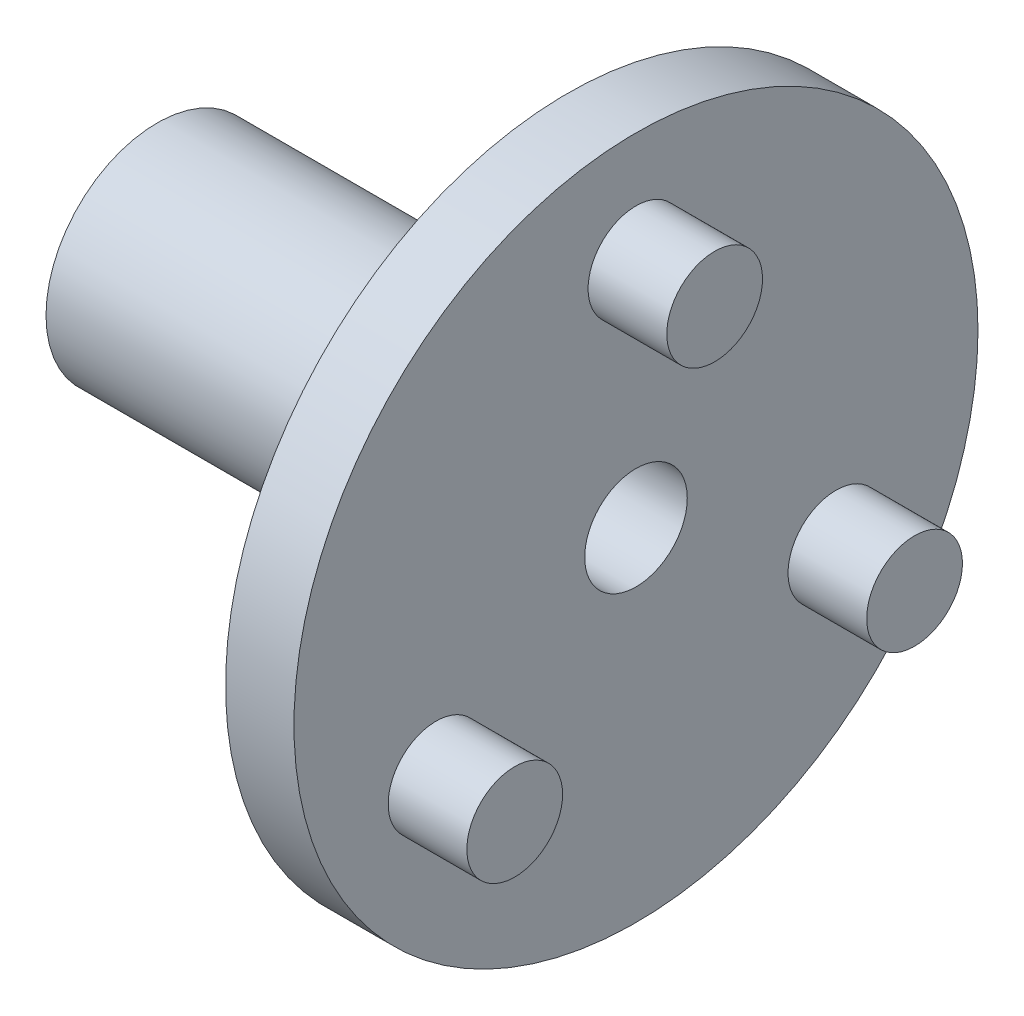
ISO-10303-21;
HEADER;
FILE_DESCRIPTION(('STEP AP214'),'2;1');
FILE_NAME('part.step','',(''),(''),'','','');
FILE_SCHEMA(('AUTOMOTIVE_DESIGN { 1 0 10303 214 1 1 1 1 }'));
ENDSEC;
DATA;
#1=APPLICATION_CONTEXT('core data for automotive mechanical design processes');
#2=APPLICATION_PROTOCOL_DEFINITION('international standard','automotive_design',2000,#1);
#3=PRODUCT_CONTEXT('',#1,'mechanical');
#4=PRODUCT('Part','Part','',(#3));
#5=PRODUCT_RELATED_PRODUCT_CATEGORY('part','',(#4));
#6=PRODUCT_DEFINITION_FORMATION('','',#4);
#7=PRODUCT_DEFINITION_CONTEXT('part definition',#1,'design');
#8=PRODUCT_DEFINITION('design','',#6,#7);
#9=PRODUCT_DEFINITION_SHAPE('','',#8);
#10=(LENGTH_UNIT() NAMED_UNIT(*) SI_UNIT(.MILLI.,.METRE.));
#11=(NAMED_UNIT(*) PLANE_ANGLE_UNIT() SI_UNIT($,.RADIAN.));
#12=(NAMED_UNIT(*) SI_UNIT($,.STERADIAN.) SOLID_ANGLE_UNIT());
#13=UNCERTAINTY_MEASURE_WITH_UNIT(LENGTH_MEASURE(1.E-05),#10,'distance_accuracy_value','');
#14=(GEOMETRIC_REPRESENTATION_CONTEXT(3) GLOBAL_UNCERTAINTY_ASSIGNED_CONTEXT((#13)) GLOBAL_UNIT_ASSIGNED_CONTEXT((#10,
#11,#12)) REPRESENTATION_CONTEXT('',''));
#15=CARTESIAN_POINT('',(0.,0.,0.));
#16=DIRECTION('',(0.,0.,1.));
#17=DIRECTION('',(1.,0.,0.));
#18=AXIS2_PLACEMENT_3D('',#15,#16,#17);
#19=CARTESIAN_POINT('',(-6.,0.,0.));
#20=DIRECTION('',(1.,0.,0.));
#21=DIRECTION('',(0.,0.,-1.));
#22=AXIS2_PLACEMENT_3D('',#19,#20,#21);
#23=CYLINDRICAL_SURFACE('',#22,5.);
#24=CARTESIAN_POINT('',(-2.,0.,0.));
#25=DIRECTION('',(1.,0.,0.));
#26=DIRECTION('',(0.,0.,-1.));
#27=AXIS2_PLACEMENT_3D('',#24,#25,#26);
#28=CIRCLE('',#27,5.);
#29=CARTESIAN_POINT('',(-2.,0.,-5.));
#30=VERTEX_POINT('',#29);
#31=EDGE_CURVE('E255',#30,#30,#28,.F.);
#32=ORIENTED_EDGE('',*,*,#31,.T.);
#33=EDGE_LOOP('',(#32));
#34=FACE_BOUND('',#33,.T.);
#35=CARTESIAN_POINT('',(-5.,0.,0.));
#36=DIRECTION('',(-1.,0.,0.));
#37=DIRECTION('',(0.,0.,1.));
#38=AXIS2_PLACEMENT_3D('',#35,#36,#37);
#39=CIRCLE('',#38,5.);
#40=CARTESIAN_POINT('',(-5.,0.,5.));
#41=VERTEX_POINT('',#40);
#42=EDGE_CURVE('E165',#41,#41,#39,.T.);
#43=ORIENTED_EDGE('',*,*,#42,.F.);
#44=EDGE_LOOP('',(#43));
#45=FACE_BOUND('',#44,.T.);
#46=ADVANCED_FACE('F44',(#34,#45),#23,.T.);
#47=CARTESIAN_POINT('',(-14.,0.,0.));
#48=DIRECTION('',(1.,0.,0.));
#49=DIRECTION('',(0.,0.,-1.));
#50=AXIS2_PLACEMENT_3D('',#47,#48,#49);
#51=CYLINDRICAL_SURFACE('',#50,2.45);
#52=CARTESIAN_POINT('',(-14.,0.,0.));
#53=DIRECTION('',(-1.,0.,0.));
#54=DIRECTION('',(0.,0.,1.));
#55=AXIS2_PLACEMENT_3D('',#52,#53,#54);
#56=CIRCLE('',#55,2.45);
#57=CARTESIAN_POINT('',(-14.,1.15868924153984,-2.15868924153984));
#58=VERTEX_POINT('',#57);
#59=CARTESIAN_POINT('',(-14.,-1.15868924153984,-2.15868924153984));
#60=VERTEX_POINT('',#59);
#61=EDGE_CURVE('E145',#58,#60,#56,.T.);
#62=ORIENTED_EDGE('',*,*,#61,.T.);
#63=DIRECTION('',(1.,0.,0.));
#64=VECTOR('',#63,1.);
#65=CARTESIAN_POINT('',(-15.4142135623731,-1.15868924153984,-2.15868924153984));
#66=LINE('',#65,#64);
#67=CARTESIAN_POINT('',(-6.,-1.15868924153984,-2.15868924153984));
#68=VERTEX_POINT('',#67);
#69=EDGE_CURVE('E68',#60,#68,#66,.T.);
#70=ORIENTED_EDGE('',*,*,#69,.T.);
#71=CARTESIAN_POINT('',(-6.,0.,0.));
#72=DIRECTION('',(-1.,0.,0.));
#73=DIRECTION('',(0.,0.,1.));
#74=AXIS2_PLACEMENT_3D('',#71,#72,#73);
#75=CIRCLE('',#74,2.45);
#76=CARTESIAN_POINT('',(-6.,1.15868924153984,-2.15868924153984));
#77=VERTEX_POINT('',#76);
#78=EDGE_CURVE('E52',#68,#77,#75,.F.);
#79=ORIENTED_EDGE('',*,*,#78,.T.);
#80=DIRECTION('',(1.,0.,0.));
#81=VECTOR('',#80,1.);
#82=CARTESIAN_POINT('',(-15.4142135623731,1.15868924153984,-2.15868924153984));
#83=LINE('',#82,#81);
#84=EDGE_CURVE('E176',#58,#77,#83,.T.);
#85=ORIENTED_EDGE('',*,*,#84,.F.);
#86=EDGE_LOOP('',(#62,#70,#79,#85));
#87=FACE_BOUND('',#86,.T.);
#88=ADVANCED_FACE('F270',(#87),#51,.F.);
#89=DIRECTION('',(1.,0.,0.));
#90=VECTOR('',#89,1.);
#91=CARTESIAN_POINT('',(-15.4142135623731,-2.15868924153984,-1.15868924153984));
#92=LINE('',#91,#90);
#93=CARTESIAN_POINT('',(-14.,-2.15868924153984,-1.15868924153984));
#94=VERTEX_POINT('',#93);
#95=CARTESIAN_POINT('',(-6.,-2.15868924153984,-1.15868924153984));
#96=VERTEX_POINT('',#95);
#97=EDGE_CURVE('E149',#94,#96,#92,.T.);
#98=ORIENTED_EDGE('',*,*,#97,.F.);
#99=CARTESIAN_POINT('',(-14.,-2.15868924153984,1.15868924153984));
#100=VERTEX_POINT('',#99);
#101=EDGE_CURVE('E133',#94,#100,#56,.T.);
#102=ORIENTED_EDGE('',*,*,#101,.T.);
#103=DIRECTION('',(1.,0.,0.));
#104=VECTOR('',#103,1.);
#105=CARTESIAN_POINT('',(-15.4142135623731,-2.15868924153984,1.15868924153984));
#106=LINE('',#105,#104);
#107=CARTESIAN_POINT('',(-6.,-2.15868924153984,1.15868924153984));
#108=VERTEX_POINT('',#107);
#109=EDGE_CURVE('E215',#100,#108,#106,.T.);
#110=ORIENTED_EDGE('',*,*,#109,.T.);
#111=EDGE_CURVE('E12',#108,#96,#75,.F.);
#112=ORIENTED_EDGE('',*,*,#111,.T.);
#113=EDGE_LOOP('',(#98,#102,#110,#112));
#114=FACE_BOUND('',#113,.T.);
#115=ADVANCED_FACE('F150',(#114),#51,.F.);
#116=DIRECTION('',(1.,0.,0.));
#117=VECTOR('',#116,1.);
#118=CARTESIAN_POINT('',(-15.4142135623731,2.15868924153984,-1.15868924153984));
#119=LINE('',#118,#117);
#120=CARTESIAN_POINT('',(-14.,2.15868924153984,-1.15868924153984));
#121=VERTEX_POINT('',#120);
#122=CARTESIAN_POINT('',(-6.,2.15868924153984,-1.15868924153984));
#123=VERTEX_POINT('',#122);
#124=EDGE_CURVE('E181',#121,#123,#119,.T.);
#125=ORIENTED_EDGE('',*,*,#124,.T.);
#126=CARTESIAN_POINT('',(-6.,2.15868924153984,1.15868924153984));
#127=VERTEX_POINT('',#126);
#128=EDGE_CURVE('E260',#123,#127,#75,.F.);
#129=ORIENTED_EDGE('',*,*,#128,.T.);
#130=DIRECTION('',(1.,0.,0.));
#131=VECTOR('',#130,1.);
#132=CARTESIAN_POINT('',(-15.4142135623731,2.15868924153984,1.15868924153984));
#133=LINE('',#132,#131);
#134=CARTESIAN_POINT('',(-14.,2.15868924153984,1.15868924153984));
#135=VERTEX_POINT('',#134);
#136=EDGE_CURVE('E192',#135,#127,#133,.T.);
#137=ORIENTED_EDGE('',*,*,#136,.F.);
#138=EDGE_CURVE('E224',#135,#121,#56,.T.);
#139=ORIENTED_EDGE('',*,*,#138,.T.);
#140=EDGE_LOOP('',(#125,#129,#137,#139));
#141=FACE_BOUND('',#140,.T.);
#142=ADVANCED_FACE('F282',(#141),#51,.F.);
#143=CARTESIAN_POINT('',(-6.,0.,0.));
#144=DIRECTION('',(-1.,0.,0.));
#145=DIRECTION('',(0.,0.,1.));
#146=AXIS2_PLACEMENT_3D('',#143,#144,#145);
#147=PLANE('',#146);
#148=DIRECTION('',(0.,-1.,0.));
#149=VECTOR('',#148,1.);
#150=CARTESIAN_POINT('',(-6.,0.,-1.15868924153984));
#151=LINE('',#150,#149);
#152=CARTESIAN_POINT('',(-6.,-1.15868924153984,-1.15868924153984));
#153=VERTEX_POINT('',#152);
#154=EDGE_CURVE('E158',#153,#96,#151,.T.);
#155=ORIENTED_EDGE('',*,*,#154,.T.);
#156=ORIENTED_EDGE('',*,*,#111,.F.);
#157=DIRECTION('',(0.,-1.,0.));
#158=VECTOR('',#157,1.);
#159=CARTESIAN_POINT('',(-6.,0.,1.15868924153984));
#160=LINE('',#159,#158);
#161=CARTESIAN_POINT('',(-6.,-1.15868924153984,1.15868924153984));
#162=VERTEX_POINT('',#161);
#163=EDGE_CURVE('E212',#162,#108,#160,.T.);
#164=ORIENTED_EDGE('',*,*,#163,.F.);
#165=DIRECTION('',(0.,0.,-1.));
#166=VECTOR('',#165,1.);
#167=CARTESIAN_POINT('',(-6.,-1.15868924153984,0.));
#168=LINE('',#167,#166);
#169=CARTESIAN_POINT('',(-6.,-1.15868924153984,2.15868924153984));
#170=VERTEX_POINT('',#169);
#171=EDGE_CURVE('E207',#170,#162,#168,.T.);
#172=ORIENTED_EDGE('',*,*,#171,.F.);
#173=CARTESIAN_POINT('',(-6.,1.15868924153984,2.15868924153984));
#174=VERTEX_POINT('',#173);
#175=EDGE_CURVE('E53',#174,#170,#75,.F.);
#176=ORIENTED_EDGE('',*,*,#175,.F.);
#177=DIRECTION('',(0.,0.,-1.));
#178=VECTOR('',#177,1.);
#179=CARTESIAN_POINT('',(-6.,1.15868924153984,0.));
#180=LINE('',#179,#178);
#181=CARTESIAN_POINT('',(-6.,1.15868924153984,1.15868924153984));
#182=VERTEX_POINT('',#181);
#183=EDGE_CURVE('E191',#174,#182,#180,.T.);
#184=ORIENTED_EDGE('',*,*,#183,.T.);
#185=DIRECTION('',(0.,-1.,0.));
#186=VECTOR('',#185,1.);
#187=CARTESIAN_POINT('',(-6.,0.,1.15868924153984));
#188=LINE('',#187,#186);
#189=EDGE_CURVE('E188',#127,#182,#188,.T.);
#190=ORIENTED_EDGE('',*,*,#189,.F.);
#191=ORIENTED_EDGE('',*,*,#128,.F.);
#192=DIRECTION('',(0.,-1.,0.));
#193=VECTOR('',#192,1.);
#194=CARTESIAN_POINT('',(-6.,0.,-1.15868924153984));
#195=LINE('',#194,#193);
#196=CARTESIAN_POINT('',(-6.,1.15868924153984,-1.15868924153984));
#197=VERTEX_POINT('',#196);
#198=EDGE_CURVE('E172',#123,#197,#195,.T.);
#199=ORIENTED_EDGE('',*,*,#198,.T.);
#200=DIRECTION('',(0.,0.,-1.));
#201=VECTOR('',#200,1.);
#202=CARTESIAN_POINT('',(-6.,1.15868924153984,0.));
#203=LINE('',#202,#201);
#204=EDGE_CURVE('E168',#197,#77,#203,.T.);
#205=ORIENTED_EDGE('',*,*,#204,.T.);
#206=ORIENTED_EDGE('',*,*,#78,.F.);
#207=DIRECTION('',(0.,0.,-1.));
#208=VECTOR('',#207,1.);
#209=CARTESIAN_POINT('',(-6.,-1.15868924153984,0.));
#210=LINE('',#209,#208);
#211=EDGE_CURVE('E60',#153,#68,#210,.T.);
#212=ORIENTED_EDGE('',*,*,#211,.F.);
#213=EDGE_LOOP('',(#155,#156,#164,#172,#176,#184,#190,#191,#199,#205,#206,#212));
#214=FACE_BOUND('',#213,.T.);
#215=CARTESIAN_POINT('',(-6.,0.,0.));
#216=DIRECTION('',(-1.,0.,0.));
#217=DIRECTION('',(0.,0.,1.));
#218=AXIS2_PLACEMENT_3D('',#215,#216,#217);
#219=CIRCLE('',#218,1.5);
#220=CARTESIAN_POINT('',(-6.,0.,1.5));
#221=VERTEX_POINT('',#220);
#222=EDGE_CURVE('E227',#221,#221,#219,.T.);
#223=ORIENTED_EDGE('',*,*,#222,.F.);
#224=EDGE_LOOP('',(#223));
#225=FACE_BOUND('',#224,.T.);
#226=ADVANCED_FACE('F272',(#214,#225),#147,.T.);
#227=DIRECTION('',(1.,0.,0.));
#228=VECTOR('',#227,1.);
#229=CARTESIAN_POINT('',(-15.4142135623731,1.15868924153984,2.15868924153984));
#230=LINE('',#229,#228);
#231=CARTESIAN_POINT('',(-14.,1.15868924153984,2.15868924153984));
#232=VERTEX_POINT('',#231);
#233=EDGE_CURVE('E201',#232,#174,#230,.T.);
#234=ORIENTED_EDGE('',*,*,#233,.T.);
#235=ORIENTED_EDGE('',*,*,#175,.T.);
#236=DIRECTION('',(1.,0.,0.));
#237=VECTOR('',#236,1.);
#238=CARTESIAN_POINT('',(-15.4142135623731,-1.15868924153984,2.15868924153984));
#239=LINE('',#238,#237);
#240=CARTESIAN_POINT('',(-14.,-1.15868924153984,2.15868924153984));
#241=VERTEX_POINT('',#240);
#242=EDGE_CURVE('E211',#241,#170,#239,.T.);
#243=ORIENTED_EDGE('',*,*,#242,.F.);
#244=EDGE_CURVE('E147',#241,#232,#56,.T.);
#245=ORIENTED_EDGE('',*,*,#244,.T.);
#246=EDGE_LOOP('',(#234,#235,#243,#245));
#247=FACE_BOUND('',#246,.T.);
#248=ADVANCED_FACE('F298',(#247),#51,.F.);
#249=CARTESIAN_POINT('',(-2.,0.,0.));
#250=DIRECTION('',(1.,0.,0.));
#251=DIRECTION('',(0.,0.,-1.));
#252=AXIS2_PLACEMENT_3D('',#249,#250,#251);
#253=PLANE('',#252);
#254=CARTESIAN_POINT('',(-2.,0.,0.));
#255=DIRECTION('',(1.,0.,0.));
#256=DIRECTION('',(0.,0.,-1.));
#257=AXIS2_PLACEMENT_3D('',#254,#255,#256);
#258=CIRCLE('',#257,10.);
#259=CARTESIAN_POINT('',(-2.,0.,-10.));
#260=VERTEX_POINT('',#259);
#261=EDGE_CURVE('E246',#260,#260,#258,.T.);
#262=ORIENTED_EDGE('',*,*,#261,.F.);
#263=EDGE_LOOP('',(#262));
#264=FACE_BOUND('',#263,.T.);
#265=ORIENTED_EDGE('',*,*,#31,.F.);
#266=EDGE_LOOP('',(#265));
#267=FACE_BOUND('',#266,.T.);
#268=ADVANCED_FACE('F300',(#264,#267),#253,.F.);
#269=CARTESIAN_POINT('',(2.3,6.75,0.));
#270=DIRECTION('',(-1.,0.,0.));
#271=DIRECTION('',(0.,0.,1.));
#272=AXIS2_PLACEMENT_3D('',#269,#270,#271);
#273=CYLINDRICAL_SURFACE('',#272,1.4);
#274=CARTESIAN_POINT('',(2.3,6.75,0.));
#275=DIRECTION('',(1.,0.,0.));
#276=DIRECTION('',(0.,0.,-1.));
#277=AXIS2_PLACEMENT_3D('',#274,#275,#276);
#278=CIRCLE('',#277,1.4);
#279=CARTESIAN_POINT('',(2.3,6.75,-1.4));
#280=VERTEX_POINT('',#279);
#281=EDGE_CURVE('E252',#280,#280,#278,.T.);
#282=ORIENTED_EDGE('',*,*,#281,.F.);
#283=EDGE_LOOP('',(#282));
#284=FACE_BOUND('',#283,.T.);
#285=CARTESIAN_POINT('',(0.,6.75,0.));
#286=DIRECTION('',(1.,0.,0.));
#287=DIRECTION('',(0.,0.,-1.));
#288=AXIS2_PLACEMENT_3D('',#285,#286,#287);
#289=CIRCLE('',#288,1.4);
#290=CARTESIAN_POINT('',(0.,6.75,-1.4));
#291=VERTEX_POINT('',#290);
#292=EDGE_CURVE('E249',#291,#291,#289,.T.);
#293=ORIENTED_EDGE('',*,*,#292,.T.);
#294=EDGE_LOOP('',(#293));
#295=FACE_BOUND('',#294,.T.);
#296=ADVANCED_FACE('F46',(#284,#295),#273,.T.);
#297=CARTESIAN_POINT('',(2.3,6.75,0.));
#298=DIRECTION('',(1.,0.,0.));
#299=DIRECTION('',(0.,0.,-1.));
#300=AXIS2_PLACEMENT_3D('',#297,#298,#299);
#301=PLANE('',#300);
#302=ORIENTED_EDGE('',*,*,#281,.T.);
#303=EDGE_LOOP('',(#302));
#304=FACE_BOUND('',#303,.T.);
#305=ADVANCED_FACE('F346',(#304),#301,.T.);
#306=CARTESIAN_POINT('',(-2.,0.,0.));
#307=DIRECTION('',(1.,0.,0.));
#308=DIRECTION('',(0.,0.,-1.));
#309=AXIS2_PLACEMENT_3D('',#306,#307,#308);
#310=CYLINDRICAL_SURFACE('',#309,10.);
#311=ORIENTED_EDGE('',*,*,#261,.T.);
#312=EDGE_LOOP('',(#311));
#313=FACE_BOUND('',#312,.T.);
#314=CARTESIAN_POINT('',(0.,0.,0.));
#315=DIRECTION('',(1.,0.,0.));
#316=DIRECTION('',(0.,0.,-1.));
#317=AXIS2_PLACEMENT_3D('',#314,#315,#316);
#318=CIRCLE('',#317,10.);
#319=CARTESIAN_POINT('',(0.,0.,-10.));
#320=VERTEX_POINT('',#319);
#321=EDGE_CURVE('E245',#320,#320,#318,.T.);
#322=ORIENTED_EDGE('',*,*,#321,.F.);
#323=EDGE_LOOP('',(#322));
#324=FACE_BOUND('',#323,.T.);
#325=ADVANCED_FACE('F343',(#313,#324),#310,.T.);
#326=CARTESIAN_POINT('',(0.,0.,0.));
#327=DIRECTION('',(1.,0.,0.));
#328=DIRECTION('',(0.,0.,-1.));
#329=AXIS2_PLACEMENT_3D('',#326,#327,#328);
#330=PLANE('',#329);
#331=CARTESIAN_POINT('',(0.,-3.37500000000025,5.84567147554453));
#332=DIRECTION('',(1.,0.,0.));
#333=DIRECTION('',(0.,0.,-1.));
#334=AXIS2_PLACEMENT_3D('',#331,#332,#333);
#335=CIRCLE('',#334,1.4);
#336=CARTESIAN_POINT('',(0.,-3.37500000000025,4.44567147554453));
#337=VERTEX_POINT('',#336);
#338=EDGE_CURVE('E230',#337,#337,#335,.T.);
#339=ORIENTED_EDGE('',*,*,#338,.F.);
#340=EDGE_LOOP('',(#339));
#341=FACE_BOUND('',#340,.T.);
#342=CARTESIAN_POINT('',(0.,-3.37499999999975,-5.84567147554539));
#343=DIRECTION('',(1.,0.,0.));
#344=DIRECTION('',(0.,0.,-1.));
#345=AXIS2_PLACEMENT_3D('',#342,#343,#344);
#346=CIRCLE('',#345,1.4);
#347=CARTESIAN_POINT('',(0.,-3.37499999999975,-7.24567147554539));
#348=VERTEX_POINT('',#347);
#349=EDGE_CURVE('E234',#348,#348,#346,.T.);
#350=ORIENTED_EDGE('',*,*,#349,.F.);
#351=EDGE_LOOP('',(#350));
#352=FACE_BOUND('',#351,.T.);
#353=ORIENTED_EDGE('',*,*,#292,.F.);
#354=EDGE_LOOP('',(#353));
#355=FACE_BOUND('',#354,.T.);
#356=CARTESIAN_POINT('',(0.,0.,0.));
#357=DIRECTION('',(1.,0.,0.));
#358=DIRECTION('',(0.,0.,-1.));
#359=AXIS2_PLACEMENT_3D('',#356,#357,#358);
#360=CIRCLE('',#359,1.5);
#361=CARTESIAN_POINT('',(0.,0.,-1.5));
#362=VERTEX_POINT('',#361);
#363=EDGE_CURVE('E240',#362,#362,#360,.T.);
#364=ORIENTED_EDGE('',*,*,#363,.F.);
#365=EDGE_LOOP('',(#364));
#366=FACE_BOUND('',#365,.T.);
#367=ORIENTED_EDGE('',*,*,#321,.T.);
#368=EDGE_LOOP('',(#367));
#369=FACE_BOUND('',#368,.T.);
#370=ADVANCED_FACE('F338',(#341,#352,#355,#366,#369),#330,.T.);
#371=CARTESIAN_POINT('',(-2.,0.,0.));
#372=DIRECTION('',(1.,0.,0.));
#373=DIRECTION('',(0.,0.,-1.));
#374=AXIS2_PLACEMENT_3D('',#371,#372,#373);
#375=CYLINDRICAL_SURFACE('',#374,1.5);
#376=ORIENTED_EDGE('',*,*,#363,.T.);
#377=EDGE_LOOP('',(#376));
#378=FACE_BOUND('',#377,.T.);
#379=ORIENTED_EDGE('',*,*,#222,.T.);
#380=EDGE_LOOP('',(#379));
#381=FACE_BOUND('',#380,.T.);
#382=ADVANCED_FACE('F335',(#378,#381),#375,.F.);
#383=CARTESIAN_POINT('',(2.3,-3.37499999999975,-5.84567147554539));
#384=DIRECTION('',(-1.,0.,0.));
#385=DIRECTION('',(0.,0.,1.));
#386=AXIS2_PLACEMENT_3D('',#383,#384,#385);
#387=CYLINDRICAL_SURFACE('',#386,1.4);
#388=CARTESIAN_POINT('',(2.3,-3.37499999999975,-5.84567147554539));
#389=DIRECTION('',(1.,0.,0.));
#390=DIRECTION('',(0.,0.,-1.));
#391=AXIS2_PLACEMENT_3D('',#388,#389,#390);
#392=CIRCLE('',#391,1.4);
#393=CARTESIAN_POINT('',(2.3,-3.37499999999975,-7.24567147554539));
#394=VERTEX_POINT('',#393);
#395=EDGE_CURVE('E237',#394,#394,#392,.T.);
#396=ORIENTED_EDGE('',*,*,#395,.F.);
#397=EDGE_LOOP('',(#396));
#398=FACE_BOUND('',#397,.T.);
#399=ORIENTED_EDGE('',*,*,#349,.T.);
#400=EDGE_LOOP('',(#399));
#401=FACE_BOUND('',#400,.T.);
#402=ADVANCED_FACE('F331',(#398,#401),#387,.T.);
#403=CARTESIAN_POINT('',(2.3,-3.37499999999975,-5.84567147554539));
#404=DIRECTION('',(1.,0.,0.));
#405=DIRECTION('',(0.,0.,-1.));
#406=AXIS2_PLACEMENT_3D('',#403,#404,#405);
#407=PLANE('',#406);
#408=ORIENTED_EDGE('',*,*,#395,.T.);
#409=EDGE_LOOP('',(#408));
#410=FACE_BOUND('',#409,.T.);
#411=ADVANCED_FACE('F327',(#410),#407,.T.);
#412=CARTESIAN_POINT('',(2.3,-3.37500000000025,5.84567147554453));
#413=DIRECTION('',(-1.,0.,0.));
#414=DIRECTION('',(0.,0.,1.));
#415=AXIS2_PLACEMENT_3D('',#412,#413,#414);
#416=CYLINDRICAL_SURFACE('',#415,1.4);
#417=CARTESIAN_POINT('',(2.3,-3.37500000000025,5.84567147554453));
#418=DIRECTION('',(1.,0.,0.));
#419=DIRECTION('',(0.,0.,-1.));
#420=AXIS2_PLACEMENT_3D('',#417,#418,#419);
#421=CIRCLE('',#420,1.4);
#422=CARTESIAN_POINT('',(2.3,-3.37500000000025,4.44567147554453));
#423=VERTEX_POINT('',#422);
#424=EDGE_CURVE('E231',#423,#423,#421,.T.);
#425=ORIENTED_EDGE('',*,*,#424,.F.);
#426=EDGE_LOOP('',(#425));
#427=FACE_BOUND('',#426,.T.);
#428=ORIENTED_EDGE('',*,*,#338,.T.);
#429=EDGE_LOOP('',(#428));
#430=FACE_BOUND('',#429,.T.);
#431=ADVANCED_FACE('F323',(#427,#430),#416,.T.);
#432=CARTESIAN_POINT('',(2.3,-3.37500000000025,5.84567147554453));
#433=DIRECTION('',(1.,0.,0.));
#434=DIRECTION('',(0.,0.,-1.));
#435=AXIS2_PLACEMENT_3D('',#432,#433,#434);
#436=PLANE('',#435);
#437=ORIENTED_EDGE('',*,*,#424,.T.);
#438=EDGE_LOOP('',(#437));
#439=FACE_BOUND('',#438,.T.);
#440=ADVANCED_FACE('F320',(#439),#436,.T.);
#441=CARTESIAN_POINT('',(-14.,0.,0.));
#442=DIRECTION('',(-1.,0.,0.));
#443=DIRECTION('',(0.,0.,1.));
#444=AXIS2_PLACEMENT_3D('',#441,#442,#443);
#445=PLANE('',#444);
#446=CARTESIAN_POINT('',(-14.,0.,0.));
#447=DIRECTION('',(-1.,0.,0.));
#448=DIRECTION('',(0.,0.,1.));
#449=AXIS2_PLACEMENT_3D('',#446,#447,#448);
#450=CIRCLE('',#449,3.25);
#451=CARTESIAN_POINT('',(-14.,0.,3.25));
#452=VERTEX_POINT('',#451);
#453=EDGE_CURVE('E223',#452,#452,#450,.T.);
#454=ORIENTED_EDGE('',*,*,#453,.T.);
#455=EDGE_LOOP('',(#454));
#456=FACE_BOUND('',#455,.T.);
#457=ORIENTED_EDGE('',*,*,#244,.F.);
#458=DIRECTION('',(0.,0.,-1.));
#459=VECTOR('',#458,1.);
#460=CARTESIAN_POINT('',(-14.,-1.15868924153984,0.));
#461=LINE('',#460,#459);
#462=CARTESIAN_POINT('',(-14.,-1.15868924153984,1.15868924153984));
#463=VERTEX_POINT('',#462);
#464=EDGE_CURVE('E210',#241,#463,#461,.T.);
#465=ORIENTED_EDGE('',*,*,#464,.T.);
#466=DIRECTION('',(0.,-1.,0.));
#467=VECTOR('',#466,1.);
#468=CARTESIAN_POINT('',(-14.,0.,1.15868924153984));
#469=LINE('',#468,#467);
#470=EDGE_CURVE('E142',#463,#100,#469,.T.);
#471=ORIENTED_EDGE('',*,*,#470,.T.);
#472=ORIENTED_EDGE('',*,*,#101,.F.);
#473=DIRECTION('',(0.,-1.,0.));
#474=VECTOR('',#473,1.);
#475=CARTESIAN_POINT('',(-14.,0.,-1.15868924153984));
#476=LINE('',#475,#474);
#477=CARTESIAN_POINT('',(-14.,-1.15868924153984,-1.15868924153984));
#478=VERTEX_POINT('',#477);
#479=EDGE_CURVE('E138',#478,#94,#476,.T.);
#480=ORIENTED_EDGE('',*,*,#479,.F.);
#481=DIRECTION('',(0.,0.,-1.));
#482=VECTOR('',#481,1.);
#483=CARTESIAN_POINT('',(-14.,-1.15868924153984,0.));
#484=LINE('',#483,#482);
#485=EDGE_CURVE('E160',#478,#60,#484,.T.);
#486=ORIENTED_EDGE('',*,*,#485,.T.);
#487=ORIENTED_EDGE('',*,*,#61,.F.);
#488=DIRECTION('',(0.,0.,-1.));
#489=VECTOR('',#488,1.);
#490=CARTESIAN_POINT('',(-14.,1.15868924153984,0.));
#491=LINE('',#490,#489);
#492=CARTESIAN_POINT('',(-14.,1.15868924153984,-1.15868924153984));
#493=VERTEX_POINT('',#492);
#494=EDGE_CURVE('E171',#493,#58,#491,.T.);
#495=ORIENTED_EDGE('',*,*,#494,.F.);
#496=DIRECTION('',(0.,-1.,0.));
#497=VECTOR('',#496,1.);
#498=CARTESIAN_POINT('',(-14.,0.,-1.15868924153984));
#499=LINE('',#498,#497);
#500=EDGE_CURVE('E177',#121,#493,#499,.T.);
#501=ORIENTED_EDGE('',*,*,#500,.F.);
#502=ORIENTED_EDGE('',*,*,#138,.F.);
#503=DIRECTION('',(0.,-1.,0.));
#504=VECTOR('',#503,1.);
#505=CARTESIAN_POINT('',(-14.,0.,1.15868924153984));
#506=LINE('',#505,#504);
#507=CARTESIAN_POINT('',(-14.,1.15868924153984,1.15868924153984));
#508=VERTEX_POINT('',#507);
#509=EDGE_CURVE('E194',#135,#508,#506,.T.);
#510=ORIENTED_EDGE('',*,*,#509,.T.);
#511=DIRECTION('',(0.,0.,-1.));
#512=VECTOR('',#511,1.);
#513=CARTESIAN_POINT('',(-14.,1.15868924153984,0.));
#514=LINE('',#513,#512);
#515=EDGE_CURVE('E187',#232,#508,#514,.T.);
#516=ORIENTED_EDGE('',*,*,#515,.F.);
#517=EDGE_LOOP('',(#457,#465,#471,#472,#480,#486,#487,#495,#501,#502,#510,#516));
#518=FACE_BOUND('',#517,.T.);
#519=ADVANCED_FACE('F135',(#456,#518),#445,.T.);
#520=CARTESIAN_POINT('',(-14.,0.,0.));
#521=DIRECTION('',(1.,0.,0.));
#522=DIRECTION('',(0.,0.,-1.));
#523=AXIS2_PLACEMENT_3D('',#520,#521,#522);
#524=CYLINDRICAL_SURFACE('',#523,3.25);
#525=ORIENTED_EDGE('',*,*,#453,.F.);
#526=EDGE_LOOP('',(#525));
#527=FACE_BOUND('',#526,.T.);
#528=CARTESIAN_POINT('',(-5.,0.,0.));
#529=DIRECTION('',(-1.,0.,0.));
#530=DIRECTION('',(0.,0.,1.));
#531=AXIS2_PLACEMENT_3D('',#528,#529,#530);
#532=CIRCLE('',#531,3.25);
#533=CARTESIAN_POINT('',(-5.,0.,3.25));
#534=VERTEX_POINT('',#533);
#535=EDGE_CURVE('E516',#534,#534,#532,.T.);
#536=ORIENTED_EDGE('',*,*,#535,.T.);
#537=EDGE_LOOP('',(#536));
#538=FACE_BOUND('',#537,.T.);
#539=ADVANCED_FACE('F423',(#527,#538),#524,.T.);
#540=CARTESIAN_POINT('',(-15.4142135623731,0.,1.15868924153984));
#541=DIRECTION('',(0.,0.,1.));
#542=DIRECTION('',(1.,0.,0.));
#543=AXIS2_PLACEMENT_3D('',#540,#541,#542);
#544=PLANE('',#543);
#545=ORIENTED_EDGE('',*,*,#470,.F.);
#546=DIRECTION('',(1.,0.,0.));
#547=VECTOR('',#546,1.);
#548=CARTESIAN_POINT('',(-15.4142135623731,-1.15868924153984,1.15868924153984));
#549=LINE('',#548,#547);
#550=EDGE_CURVE('E200',#463,#162,#549,.T.);
#551=ORIENTED_EDGE('',*,*,#550,.T.);
#552=ORIENTED_EDGE('',*,*,#163,.T.);
#553=ORIENTED_EDGE('',*,*,#109,.F.);
#554=EDGE_LOOP('',(#545,#551,#552,#553));
#555=FACE_BOUND('',#554,.T.);
#556=ADVANCED_FACE('F291',(#555),#544,.F.);
#557=CARTESIAN_POINT('',(-15.4142135623731,-1.15868924153984,0.));
#558=DIRECTION('',(0.,-1.,0.));
#559=DIRECTION('',(0.,0.,-1.));
#560=AXIS2_PLACEMENT_3D('',#557,#558,#559);
#561=PLANE('',#560);
#562=ORIENTED_EDGE('',*,*,#464,.F.);
#563=ORIENTED_EDGE('',*,*,#242,.T.);
#564=ORIENTED_EDGE('',*,*,#171,.T.);
#565=ORIENTED_EDGE('',*,*,#550,.F.);
#566=EDGE_LOOP('',(#562,#563,#564,#565));
#567=FACE_BOUND('',#566,.T.);
#568=ADVANCED_FACE('F294',(#567),#561,.F.);
#569=CARTESIAN_POINT('',(-15.4142135623731,1.15868924153984,0.));
#570=DIRECTION('',(0.,-1.,0.));
#571=DIRECTION('',(0.,0.,-1.));
#572=AXIS2_PLACEMENT_3D('',#569,#570,#571);
#573=PLANE('',#572);
#574=ORIENTED_EDGE('',*,*,#233,.F.);
#575=ORIENTED_EDGE('',*,*,#515,.T.);
#576=DIRECTION('',(1.,0.,0.));
#577=VECTOR('',#576,1.);
#578=CARTESIAN_POINT('',(-15.4142135623731,1.15868924153984,1.15868924153984));
#579=LINE('',#578,#577);
#580=EDGE_CURVE('E197',#508,#182,#579,.T.);
#581=ORIENTED_EDGE('',*,*,#580,.T.);
#582=ORIENTED_EDGE('',*,*,#183,.F.);
#583=EDGE_LOOP('',(#574,#575,#581,#582));
#584=FACE_BOUND('',#583,.T.);
#585=ADVANCED_FACE('F297',(#584),#573,.T.);
#586=CARTESIAN_POINT('',(-15.4142135623731,0.,1.15868924153984));
#587=DIRECTION('',(0.,0.,1.));
#588=DIRECTION('',(1.,0.,0.));
#589=AXIS2_PLACEMENT_3D('',#586,#587,#588);
#590=PLANE('',#589);
#591=ORIENTED_EDGE('',*,*,#509,.F.);
#592=ORIENTED_EDGE('',*,*,#136,.T.);
#593=ORIENTED_EDGE('',*,*,#189,.T.);
#594=ORIENTED_EDGE('',*,*,#580,.F.);
#595=EDGE_LOOP('',(#591,#592,#593,#594));
#596=FACE_BOUND('',#595,.T.);
#597=ADVANCED_FACE('F286',(#596),#590,.F.);
#598=CARTESIAN_POINT('',(-15.4142135623731,1.15868924153984,0.));
#599=DIRECTION('',(0.,-1.,0.));
#600=DIRECTION('',(0.,0.,-1.));
#601=AXIS2_PLACEMENT_3D('',#598,#599,#600);
#602=PLANE('',#601);
#603=DIRECTION('',(1.,0.,0.));
#604=VECTOR('',#603,1.);
#605=CARTESIAN_POINT('',(-15.4142135623731,1.15868924153984,-1.15868924153984));
#606=LINE('',#605,#604);
#607=EDGE_CURVE('E180',#493,#197,#606,.T.);
#608=ORIENTED_EDGE('',*,*,#607,.F.);
#609=ORIENTED_EDGE('',*,*,#494,.T.);
#610=ORIENTED_EDGE('',*,*,#84,.T.);
#611=ORIENTED_EDGE('',*,*,#204,.F.);
#612=EDGE_LOOP('',(#608,#609,#610,#611));
#613=FACE_BOUND('',#612,.T.);
#614=ADVANCED_FACE('F277',(#613),#602,.T.);
#615=CARTESIAN_POINT('',(-15.4142135623731,0.,-1.15868924153984));
#616=DIRECTION('',(0.,0.,1.));
#617=DIRECTION('',(1.,0.,0.));
#618=AXIS2_PLACEMENT_3D('',#615,#616,#617);
#619=PLANE('',#618);
#620=ORIENTED_EDGE('',*,*,#124,.F.);
#621=ORIENTED_EDGE('',*,*,#500,.T.);
#622=ORIENTED_EDGE('',*,*,#607,.T.);
#623=ORIENTED_EDGE('',*,*,#198,.F.);
#624=EDGE_LOOP('',(#620,#621,#622,#623));
#625=FACE_BOUND('',#624,.T.);
#626=ADVANCED_FACE('F281',(#625),#619,.T.);
#627=CARTESIAN_POINT('',(-15.4142135623731,0.,-1.15868924153984));
#628=DIRECTION('',(0.,0.,1.));
#629=DIRECTION('',(1.,0.,0.));
#630=AXIS2_PLACEMENT_3D('',#627,#628,#629);
#631=PLANE('',#630);
#632=DIRECTION('',(1.,0.,0.));
#633=VECTOR('',#632,1.);
#634=CARTESIAN_POINT('',(-15.4142135623731,-1.15868924153984,-1.15868924153984));
#635=LINE('',#634,#633);
#636=EDGE_CURVE('E157',#478,#153,#635,.T.);
#637=ORIENTED_EDGE('',*,*,#636,.F.);
#638=ORIENTED_EDGE('',*,*,#479,.T.);
#639=ORIENTED_EDGE('',*,*,#97,.T.);
#640=ORIENTED_EDGE('',*,*,#154,.F.);
#641=EDGE_LOOP('',(#637,#638,#639,#640));
#642=FACE_BOUND('',#641,.T.);
#643=ADVANCED_FACE('F156',(#642),#631,.T.);
#644=CARTESIAN_POINT('',(-15.4142135623731,-1.15868924153984,0.));
#645=DIRECTION('',(0.,-1.,0.));
#646=DIRECTION('',(0.,0.,-1.));
#647=AXIS2_PLACEMENT_3D('',#644,#645,#646);
#648=PLANE('',#647);
#649=ORIENTED_EDGE('',*,*,#485,.F.);
#650=ORIENTED_EDGE('',*,*,#636,.T.);
#651=ORIENTED_EDGE('',*,*,#211,.T.);
#652=ORIENTED_EDGE('',*,*,#69,.F.);
#653=EDGE_LOOP('',(#649,#650,#651,#652));
#654=FACE_BOUND('',#653,.T.);
#655=ADVANCED_FACE('F289',(#654),#648,.F.);
#656=CARTESIAN_POINT('',(-5.,0.,0.));
#657=DIRECTION('',(-1.,0.,0.));
#658=DIRECTION('',(0.,0.,1.));
#659=AXIS2_PLACEMENT_3D('',#656,#657,#658);
#660=PLANE('',#659);
#661=ORIENTED_EDGE('',*,*,#535,.F.);
#662=EDGE_LOOP('',(#661));
#663=FACE_BOUND('',#662,.T.);
#664=ORIENTED_EDGE('',*,*,#42,.T.);
#665=EDGE_LOOP('',(#664));
#666=FACE_BOUND('',#665,.T.);
#667=ADVANCED_FACE('F488',(#663,#666),#660,.T.);
#668=CLOSED_SHELL('',(#46,#88,#115,#142,#226,#248,#268,#296,#305,#325,#370,#382,#402,#411,#431,
#440,#519,#539,#556,#568,#585,#597,#614,#626,#643,#655,#667));
#669=MANIFOLD_SOLID_BREP('B2',#668);
#670=ADVANCED_BREP_SHAPE_REPRESENTATION('',(#18,#669),#14);
#671=SHAPE_DEFINITION_REPRESENTATION(#9,#670);
ENDSEC;
END-ISO-10303-21;
